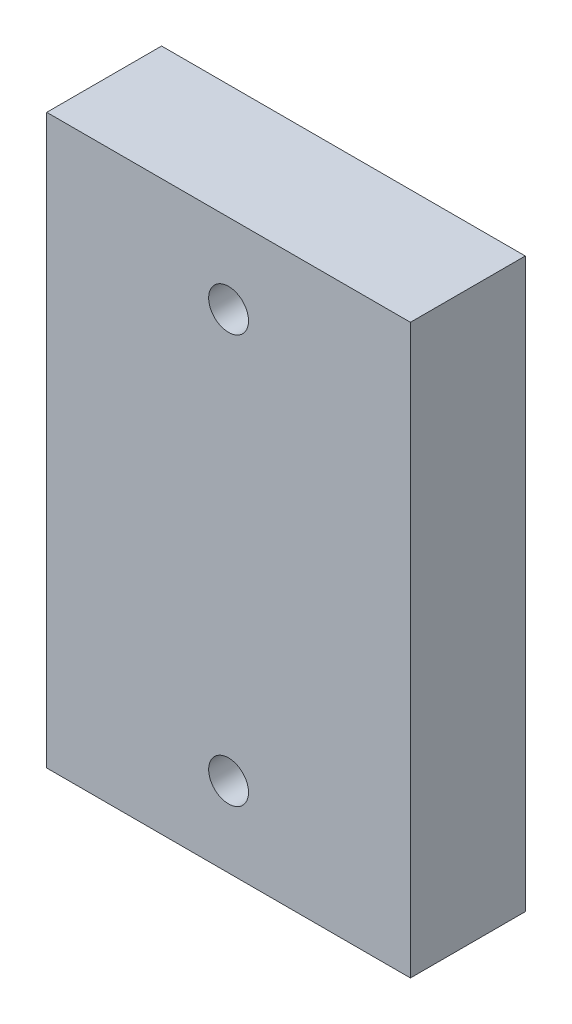
ISO-10303-21;
HEADER;
FILE_DESCRIPTION(('STEP AP214'),'2;1');
FILE_NAME('part.step','',(''),(''),'','','');
FILE_SCHEMA(('AUTOMOTIVE_DESIGN { 1 0 10303 214 1 1 1 1 }'));
ENDSEC;
DATA;
#1=APPLICATION_CONTEXT('core data for automotive mechanical design processes');
#2=APPLICATION_PROTOCOL_DEFINITION('international standard','automotive_design',2000,#1);
#3=PRODUCT_CONTEXT('',#1,'mechanical');
#4=PRODUCT('Part','Part','',(#3));
#5=PRODUCT_RELATED_PRODUCT_CATEGORY('part','',(#4));
#6=PRODUCT_DEFINITION_FORMATION('','',#4);
#7=PRODUCT_DEFINITION_CONTEXT('part definition',#1,'design');
#8=PRODUCT_DEFINITION('design','',#6,#7);
#9=PRODUCT_DEFINITION_SHAPE('','',#8);
#10=(LENGTH_UNIT() NAMED_UNIT(*) SI_UNIT(.MILLI.,.METRE.));
#11=(NAMED_UNIT(*) PLANE_ANGLE_UNIT() SI_UNIT($,.RADIAN.));
#12=(NAMED_UNIT(*) SI_UNIT($,.STERADIAN.) SOLID_ANGLE_UNIT());
#13=UNCERTAINTY_MEASURE_WITH_UNIT(LENGTH_MEASURE(1.E-05),#10,'distance_accuracy_value','');
#14=(GEOMETRIC_REPRESENTATION_CONTEXT(3) GLOBAL_UNCERTAINTY_ASSIGNED_CONTEXT((#13)) GLOBAL_UNIT_ASSIGNED_CONTEXT((#10,
#11,#12)) REPRESENTATION_CONTEXT('',''));
#15=CARTESIAN_POINT('',(0.,0.,0.));
#16=DIRECTION('',(0.,0.,1.));
#17=DIRECTION('',(1.,0.,0.));
#18=AXIS2_PLACEMENT_3D('',#15,#16,#17);
#19=CARTESIAN_POINT('',(-103.059455126025,39.1820535593755,18.288));
#20=DIRECTION('',(1.,0.,0.));
#21=DIRECTION('',(0.,1.,0.));
#22=AXIS2_PLACEMENT_3D('',#19,#20,#21);
#23=PLANE('',#22);
#24=DIRECTION('',(0.,-1.,0.));
#25=VECTOR('',#24,1.);
#26=CARTESIAN_POINT('',(-103.059455126025,39.1820535593755,0.));
#27=LINE('',#26,#25);
#28=CARTESIAN_POINT('',(-103.059455126025,39.1820535593755,0.));
#29=VERTEX_POINT('',#28);
#30=CARTESIAN_POINT('',(-103.059455126025,-51.2419464406245,0.));
#31=VERTEX_POINT('',#30);
#32=EDGE_CURVE('E110',#29,#31,#27,.T.);
#33=ORIENTED_EDGE('',*,*,#32,.T.);
#34=DIRECTION('',(0.,0.,-1.));
#35=VECTOR('',#34,1.);
#36=CARTESIAN_POINT('',(-103.059455126025,-51.2419464406245,18.288));
#37=LINE('',#36,#35);
#38=CARTESIAN_POINT('',(-103.059455126025,-51.2419464406245,18.288));
#39=VERTEX_POINT('',#38);
#40=EDGE_CURVE('E11',#39,#31,#37,.T.);
#41=ORIENTED_EDGE('',*,*,#40,.F.);
#42=DIRECTION('',(0.,-1.,0.));
#43=VECTOR('',#42,1.);
#44=CARTESIAN_POINT('',(-103.059455126025,39.1820535593755,18.288));
#45=LINE('',#44,#43);
#46=CARTESIAN_POINT('',(-103.059455126025,39.1820535593755,18.288));
#47=VERTEX_POINT('',#46);
#48=EDGE_CURVE('E93',#47,#39,#45,.T.);
#49=ORIENTED_EDGE('',*,*,#48,.F.);
#50=DIRECTION('',(0.,0.,-1.));
#51=VECTOR('',#50,1.);
#52=CARTESIAN_POINT('',(-103.059455126025,39.1820535593755,18.288));
#53=LINE('',#52,#51);
#54=EDGE_CURVE('E106',#47,#29,#53,.T.);
#55=ORIENTED_EDGE('',*,*,#54,.T.);
#56=EDGE_LOOP('',(#33,#41,#49,#55));
#57=FACE_BOUND('',#56,.T.);
#58=ADVANCED_FACE('F39',(#57),#23,.F.);
#59=CARTESIAN_POINT('',(-103.059455126025,-51.2419464406245,18.288));
#60=DIRECTION('',(0.,1.,0.));
#61=DIRECTION('',(0.,0.,1.));
#62=AXIS2_PLACEMENT_3D('',#59,#60,#61);
#63=PLANE('',#62);
#64=DIRECTION('',(1.,0.,0.));
#65=VECTOR('',#64,1.);
#66=CARTESIAN_POINT('',(-103.059455126025,-51.2419464406245,0.));
#67=LINE('',#66,#65);
#68=CARTESIAN_POINT('',(-45.1474551260252,-51.2419464406245,0.));
#69=VERTEX_POINT('',#68);
#70=EDGE_CURVE('E98',#31,#69,#67,.T.);
#71=ORIENTED_EDGE('',*,*,#70,.T.);
#72=DIRECTION('',(0.,0.,-1.));
#73=VECTOR('',#72,1.);
#74=CARTESIAN_POINT('',(-45.1474551260252,-51.2419464406245,18.288));
#75=LINE('',#74,#73);
#76=CARTESIAN_POINT('',(-45.1474551260252,-51.2419464406245,18.288));
#77=VERTEX_POINT('',#76);
#78=EDGE_CURVE('E49',#77,#69,#75,.T.);
#79=ORIENTED_EDGE('',*,*,#78,.F.);
#80=DIRECTION('',(1.,0.,0.));
#81=VECTOR('',#80,1.);
#82=CARTESIAN_POINT('',(-103.059455126025,-51.2419464406245,18.288));
#83=LINE('',#82,#81);
#84=EDGE_CURVE('E88',#39,#77,#83,.T.);
#85=ORIENTED_EDGE('',*,*,#84,.F.);
#86=ORIENTED_EDGE('',*,*,#40,.T.);
#87=EDGE_LOOP('',(#71,#79,#85,#86));
#88=FACE_BOUND('',#87,.T.);
#89=ADVANCED_FACE('F97',(#88),#63,.F.);
#90=CARTESIAN_POINT('',(-45.1474551260252,39.1820535593755,18.288));
#91=DIRECTION('',(-1.,0.,0.));
#92=DIRECTION('',(0.,-1.,0.));
#93=AXIS2_PLACEMENT_3D('',#90,#91,#92);
#94=PLANE('',#93);
#95=DIRECTION('',(0.,1.,0.));
#96=VECTOR('',#95,1.);
#97=CARTESIAN_POINT('',(-45.1474551260252,39.1820535593755,0.));
#98=LINE('',#97,#96);
#99=CARTESIAN_POINT('',(-45.1474551260252,39.1820535593755,0.));
#100=VERTEX_POINT('',#99);
#101=EDGE_CURVE('E75',#69,#100,#98,.T.);
#102=ORIENTED_EDGE('',*,*,#101,.T.);
#103=DIRECTION('',(0.,0.,-1.));
#104=VECTOR('',#103,1.);
#105=CARTESIAN_POINT('',(-45.1474551260252,39.1820535593755,18.288));
#106=LINE('',#105,#104);
#107=CARTESIAN_POINT('',(-45.1474551260252,39.1820535593755,18.288));
#108=VERTEX_POINT('',#107);
#109=EDGE_CURVE('E100',#108,#100,#106,.T.);
#110=ORIENTED_EDGE('',*,*,#109,.F.);
#111=DIRECTION('',(0.,1.,0.));
#112=VECTOR('',#111,1.);
#113=CARTESIAN_POINT('',(-45.1474551260252,39.1820535593755,18.288));
#114=LINE('',#113,#112);
#115=EDGE_CURVE('E91',#77,#108,#114,.T.);
#116=ORIENTED_EDGE('',*,*,#115,.F.);
#117=ORIENTED_EDGE('',*,*,#78,.T.);
#118=EDGE_LOOP('',(#102,#110,#116,#117));
#119=FACE_BOUND('',#118,.T.);
#120=ADVANCED_FACE('F102',(#119),#94,.F.);
#121=CARTESIAN_POINT('',(-103.059455126025,39.1820535593755,18.288));
#122=DIRECTION('',(0.,-1.,0.));
#123=DIRECTION('',(0.,0.,-1.));
#124=AXIS2_PLACEMENT_3D('',#121,#122,#123);
#125=PLANE('',#124);
#126=DIRECTION('',(-1.,0.,0.));
#127=VECTOR('',#126,1.);
#128=CARTESIAN_POINT('',(-103.059455126025,39.1820535593755,0.));
#129=LINE('',#128,#127);
#130=EDGE_CURVE('E81',#100,#29,#129,.T.);
#131=ORIENTED_EDGE('',*,*,#130,.T.);
#132=ORIENTED_EDGE('',*,*,#54,.F.);
#133=DIRECTION('',(-1.,0.,0.));
#134=VECTOR('',#133,1.);
#135=CARTESIAN_POINT('',(-103.059455126025,39.1820535593755,18.288));
#136=LINE('',#135,#134);
#137=EDGE_CURVE('E58',#108,#47,#136,.T.);
#138=ORIENTED_EDGE('',*,*,#137,.F.);
#139=ORIENTED_EDGE('',*,*,#109,.T.);
#140=EDGE_LOOP('',(#131,#132,#138,#139));
#141=FACE_BOUND('',#140,.T.);
#142=ADVANCED_FACE('F148',(#141),#125,.F.);
#143=CARTESIAN_POINT('',(0.,0.,18.288));
#144=DIRECTION('',(0.,0.,1.));
#145=DIRECTION('',(1.,0.,0.));
#146=AXIS2_PLACEMENT_3D('',#143,#144,#145);
#147=PLANE('',#146);
#148=CARTESIAN_POINT('',(-74.1034551260252,26.4820535593755,18.288));
#149=DIRECTION('',(0.,0.,1.));
#150=DIRECTION('',(1.,0.,0.));
#151=AXIS2_PLACEMENT_3D('',#148,#149,#150);
#152=CIRCLE('',#151,3.175);
#153=CARTESIAN_POINT('',(-70.9284551260252,26.4820535593755,18.288));
#154=VERTEX_POINT('',#153);
#155=EDGE_CURVE('E126',#154,#154,#152,.T.);
#156=ORIENTED_EDGE('',*,*,#155,.F.);
#157=EDGE_LOOP('',(#156));
#158=FACE_BOUND('',#157,.T.);
#159=CARTESIAN_POINT('',(-74.1034551260252,-38.5419464406245,18.288));
#160=DIRECTION('',(0.,0.,1.));
#161=DIRECTION('',(1.,0.,0.));
#162=AXIS2_PLACEMENT_3D('',#159,#160,#161);
#163=CIRCLE('',#162,3.175);
#164=CARTESIAN_POINT('',(-70.9284551260252,-38.5419464406245,18.288));
#165=VERTEX_POINT('',#164);
#166=EDGE_CURVE('E133',#165,#165,#163,.T.);
#167=ORIENTED_EDGE('',*,*,#166,.F.);
#168=EDGE_LOOP('',(#167));
#169=FACE_BOUND('',#168,.T.);
#170=ORIENTED_EDGE('',*,*,#48,.T.);
#171=ORIENTED_EDGE('',*,*,#84,.T.);
#172=ORIENTED_EDGE('',*,*,#115,.T.);
#173=ORIENTED_EDGE('',*,*,#137,.T.);
#174=EDGE_LOOP('',(#170,#171,#172,#173));
#175=FACE_BOUND('',#174,.T.);
#176=ADVANCED_FACE('F89',(#158,#169,#175),#147,.T.);
#177=CARTESIAN_POINT('',(0.,0.,0.));
#178=DIRECTION('',(0.,0.,1.));
#179=DIRECTION('',(1.,0.,0.));
#180=AXIS2_PLACEMENT_3D('',#177,#178,#179);
#181=PLANE('',#180);
#182=CARTESIAN_POINT('',(-74.1034551260252,26.4820535593755,0.));
#183=DIRECTION('',(0.,0.,1.));
#184=DIRECTION('',(1.,0.,0.));
#185=AXIS2_PLACEMENT_3D('',#182,#183,#184);
#186=CIRCLE('',#185,3.175);
#187=CARTESIAN_POINT('',(-70.9284551260252,26.4820535593755,0.));
#188=VERTEX_POINT('',#187);
#189=EDGE_CURVE('E42',#188,#188,#186,.T.);
#190=ORIENTED_EDGE('',*,*,#189,.T.);
#191=EDGE_LOOP('',(#190));
#192=FACE_BOUND('',#191,.T.);
#193=CARTESIAN_POINT('',(-74.1034551260252,-38.5419464406245,0.));
#194=DIRECTION('',(0.,0.,1.));
#195=DIRECTION('',(1.,0.,0.));
#196=AXIS2_PLACEMENT_3D('',#193,#194,#195);
#197=CIRCLE('',#196,3.175);
#198=CARTESIAN_POINT('',(-70.9284551260252,-38.5419464406245,0.));
#199=VERTEX_POINT('',#198);
#200=EDGE_CURVE('E123',#199,#199,#197,.T.);
#201=ORIENTED_EDGE('',*,*,#200,.T.);
#202=EDGE_LOOP('',(#201));
#203=FACE_BOUND('',#202,.T.);
#204=ORIENTED_EDGE('',*,*,#32,.F.);
#205=ORIENTED_EDGE('',*,*,#130,.F.);
#206=ORIENTED_EDGE('',*,*,#101,.F.);
#207=ORIENTED_EDGE('',*,*,#70,.F.);
#208=EDGE_LOOP('',(#204,#205,#206,#207));
#209=FACE_BOUND('',#208,.T.);
#210=ADVANCED_FACE('F147',(#192,#203,#209),#181,.F.);
#211=CARTESIAN_POINT('',(-74.1034551260252,-38.5419464406245,-7.112));
#212=DIRECTION('',(0.,0.,1.));
#213=DIRECTION('',(1.,0.,0.));
#214=AXIS2_PLACEMENT_3D('',#211,#212,#213);
#215=CYLINDRICAL_SURFACE('',#214,3.175);
#216=ORIENTED_EDGE('',*,*,#166,.T.);
#217=EDGE_LOOP('',(#216));
#218=FACE_BOUND('',#217,.T.);
#219=ORIENTED_EDGE('',*,*,#200,.F.);
#220=EDGE_LOOP('',(#219));
#221=FACE_BOUND('',#220,.T.);
#222=ADVANCED_FACE('F143',(#218,#221),#215,.F.);
#223=CARTESIAN_POINT('',(-74.1034551260252,26.4820535593755,-7.112));
#224=DIRECTION('',(0.,0.,1.));
#225=DIRECTION('',(1.,0.,0.));
#226=AXIS2_PLACEMENT_3D('',#223,#224,#225);
#227=CYLINDRICAL_SURFACE('',#226,3.175);
#228=ORIENTED_EDGE('',*,*,#155,.T.);
#229=EDGE_LOOP('',(#228));
#230=FACE_BOUND('',#229,.T.);
#231=ORIENTED_EDGE('',*,*,#189,.F.);
#232=EDGE_LOOP('',(#231));
#233=FACE_BOUND('',#232,.T.);
#234=ADVANCED_FACE('F195',(#230,#233),#227,.F.);
#235=CLOSED_SHELL('',(#58,#89,#120,#142,#176,#210,#222,#234));
#236=MANIFOLD_SOLID_BREP('B2',#235);
#237=ADVANCED_BREP_SHAPE_REPRESENTATION('',(#18,#236),#14);
#238=SHAPE_DEFINITION_REPRESENTATION(#9,#237);
ENDSEC;
END-ISO-10303-21;
